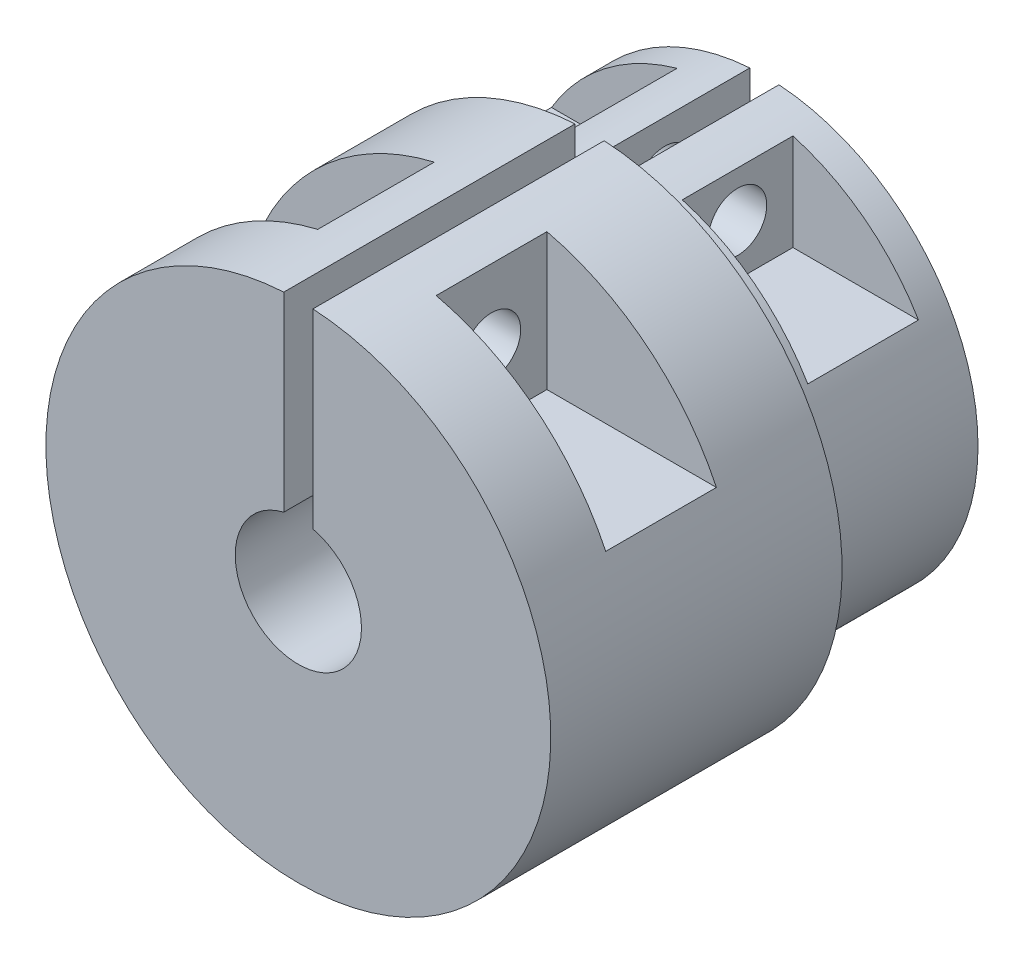
ISO-10303-21;
HEADER;
FILE_DESCRIPTION(('STEP AP214'),'2;1');
FILE_NAME('part.step','',(''),(''),'','','');
FILE_SCHEMA(('AUTOMOTIVE_DESIGN { 1 0 10303 214 1 1 1 1 }'));
ENDSEC;
DATA;
#1=APPLICATION_CONTEXT('core data for automotive mechanical design processes');
#2=APPLICATION_PROTOCOL_DEFINITION('international standard','automotive_design',2000,#1);
#3=PRODUCT_CONTEXT('',#1,'mechanical');
#4=PRODUCT('Part','Part','',(#3));
#5=PRODUCT_RELATED_PRODUCT_CATEGORY('part','',(#4));
#6=PRODUCT_DEFINITION_FORMATION('','',#4);
#7=PRODUCT_DEFINITION_CONTEXT('part definition',#1,'design');
#8=PRODUCT_DEFINITION('design','',#6,#7);
#9=PRODUCT_DEFINITION_SHAPE('','',#8);
#10=(LENGTH_UNIT() NAMED_UNIT(*) SI_UNIT(.MILLI.,.METRE.));
#11=(NAMED_UNIT(*) PLANE_ANGLE_UNIT() SI_UNIT($,.RADIAN.));
#12=(NAMED_UNIT(*) SI_UNIT($,.STERADIAN.) SOLID_ANGLE_UNIT());
#13=UNCERTAINTY_MEASURE_WITH_UNIT(LENGTH_MEASURE(1.E-05),#10,'distance_accuracy_value','');
#14=(GEOMETRIC_REPRESENTATION_CONTEXT(3) GLOBAL_UNCERTAINTY_ASSIGNED_CONTEXT((#13)) GLOBAL_UNIT_ASSIGNED_CONTEXT((#10,
#11,#12)) REPRESENTATION_CONTEXT('',''));
#15=CARTESIAN_POINT('',(0.,0.,0.));
#16=DIRECTION('',(0.,0.,1.));
#17=DIRECTION('',(1.,0.,0.));
#18=AXIS2_PLACEMENT_3D('',#15,#16,#17);
#19=CARTESIAN_POINT('',(0.,0.,9.));
#20=DIRECTION('',(0.,0.,-1.));
#21=DIRECTION('',(-1.,0.,0.));
#22=AXIS2_PLACEMENT_3D('',#19,#20,#21);
#23=CYLINDRICAL_SURFACE('',#22,11.);
#24=DIRECTION('',(0.,0.,-1.));
#25=VECTOR('',#24,1.);
#26=CARTESIAN_POINT('',(-0.75,10.974402033824,9.));
#27=LINE('',#26,#25);
#28=CARTESIAN_POINT('',(-0.75,10.974402033824,9.));
#29=VERTEX_POINT('',#28);
#30=CARTESIAN_POINT('',(-0.75,10.974402033824,0.));
#31=VERTEX_POINT('',#30);
#32=EDGE_CURVE('E278',#29,#31,#27,.T.);
#33=ORIENTED_EDGE('',*,*,#32,.T.);
#34=CARTESIAN_POINT('',(0.,0.,0.));
#35=DIRECTION('',(0.,0.,-1.));
#36=DIRECTION('',(-1.,0.,0.));
#37=AXIS2_PLACEMENT_3D('',#34,#35,#36);
#38=CIRCLE('',#37,11.);
#39=CARTESIAN_POINT('',(0.75,10.974402033824,0.));
#40=VERTEX_POINT('',#39);
#41=EDGE_CURVE('E273',#40,#31,#38,.T.);
#42=ORIENTED_EDGE('',*,*,#41,.F.);
#43=DIRECTION('',(0.,0.,-1.));
#44=VECTOR('',#43,1.);
#45=CARTESIAN_POINT('',(0.75,10.974402033824,9.));
#46=LINE('',#45,#44);
#47=CARTESIAN_POINT('',(0.75,10.974402033824,9.));
#48=VERTEX_POINT('',#47);
#49=EDGE_CURVE('E361',#40,#48,#46,.F.);
#50=ORIENTED_EDGE('',*,*,#49,.T.);
#51=CARTESIAN_POINT('',(0.,0.,9.));
#52=DIRECTION('',(0.,0.,-1.));
#53=DIRECTION('',(-1.,0.,0.));
#54=AXIS2_PLACEMENT_3D('',#51,#52,#53);
#55=CIRCLE('',#54,11.);
#56=EDGE_CURVE('E275',#48,#29,#55,.T.);
#57=ORIENTED_EDGE('',*,*,#56,.T.);
#58=EDGE_LOOP('',(#33,#42,#50,#57));
#59=FACE_BOUND('',#58,.T.);
#60=CARTESIAN_POINT('',(0.,0.,1.5));
#61=DIRECTION('',(0.,0.,-1.));
#62=DIRECTION('',(0.,1.,0.));
#63=AXIS2_PLACEMENT_3D('',#60,#61,#62);
#64=CIRCLE('',#63,11.);
#65=CARTESIAN_POINT('',(-3.,10.5830052442584,1.5));
#66=VERTEX_POINT('',#65);
#67=CARTESIAN_POINT('',(-9.46448963687413,5.60566105945607,1.5));
#68=VERTEX_POINT('',#67);
#69=EDGE_CURVE('E373',#66,#68,#64,.F.);
#70=ORIENTED_EDGE('',*,*,#69,.F.);
#71=DIRECTION('',(0.,0.,-1.));
#72=VECTOR('',#71,1.);
#73=CARTESIAN_POINT('',(-3.,10.5830052442584,9.));
#74=LINE('',#73,#72);
#75=CARTESIAN_POINT('',(-3.,10.5830052442584,7.5));
#76=VERTEX_POINT('',#75);
#77=EDGE_CURVE('E365',#66,#76,#74,.F.);
#78=ORIENTED_EDGE('',*,*,#77,.T.);
#79=CARTESIAN_POINT('',(0.,0.,7.5));
#80=DIRECTION('',(0.,0.,1.));
#81=DIRECTION('',(0.,-1.,0.));
#82=AXIS2_PLACEMENT_3D('',#79,#80,#81);
#83=CIRCLE('',#82,11.);
#84=CARTESIAN_POINT('',(-9.46448963687413,5.60566105945607,7.5));
#85=VERTEX_POINT('',#84);
#86=EDGE_CURVE('E368',#85,#76,#83,.F.);
#87=ORIENTED_EDGE('',*,*,#86,.F.);
#88=DIRECTION('',(0.,0.,-1.));
#89=VECTOR('',#88,1.);
#90=CARTESIAN_POINT('',(-9.46448963687413,5.60566105945607,9.));
#91=LINE('',#90,#89);
#92=EDGE_CURVE('E371',#68,#85,#91,.F.);
#93=ORIENTED_EDGE('',*,*,#92,.F.);
#94=EDGE_LOOP('',(#70,#78,#87,#93));
#95=FACE_BOUND('',#94,.T.);
#96=DIRECTION('',(0.,0.,-1.));
#97=VECTOR('',#96,1.);
#98=CARTESIAN_POINT('',(9.46448963687413,5.60566105945607,9.));
#99=LINE('',#98,#97);
#100=CARTESIAN_POINT('',(9.46448963687413,5.60566105945607,1.53073417001327));
#101=VERTEX_POINT('',#100);
#102=CARTESIAN_POINT('',(9.46448963687413,5.60566105945607,7.23073417001327));
#103=VERTEX_POINT('',#102);
#104=EDGE_CURVE('E39',#101,#103,#99,.F.);
#105=ORIENTED_EDGE('',*,*,#104,.T.);
#106=CARTESIAN_POINT('',(0.,0.,7.23073417001327));
#107=DIRECTION('',(0.,0.,-1.));
#108=DIRECTION('',(0.,1.,0.));
#109=AXIS2_PLACEMENT_3D('',#106,#107,#108);
#110=CIRCLE('',#109,11.);
#111=CARTESIAN_POINT('',(3.,10.5830052442584,7.23073417001327));
#112=VERTEX_POINT('',#111);
#113=EDGE_CURVE('E11',#103,#112,#110,.F.);
#114=ORIENTED_EDGE('',*,*,#113,.T.);
#115=DIRECTION('',(0.,0.,-1.));
#116=VECTOR('',#115,1.);
#117=CARTESIAN_POINT('',(3.,10.5830052442584,9.));
#118=LINE('',#117,#116);
#119=CARTESIAN_POINT('',(3.,10.5830052442584,1.53073417001327));
#120=VERTEX_POINT('',#119);
#121=EDGE_CURVE('E208',#112,#120,#118,.T.);
#122=ORIENTED_EDGE('',*,*,#121,.T.);
#123=CARTESIAN_POINT('',(0.,0.,1.53073417001327));
#124=DIRECTION('',(0.,0.,1.));
#125=DIRECTION('',(0.,-1.,0.));
#126=AXIS2_PLACEMENT_3D('',#123,#124,#125);
#127=CIRCLE('',#126,11.);
#128=EDGE_CURVE('E394',#120,#101,#127,.F.);
#129=ORIENTED_EDGE('',*,*,#128,.T.);
#130=EDGE_LOOP('',(#105,#114,#122,#129));
#131=FACE_BOUND('',#130,.T.);
#132=ADVANCED_FACE('F31',(#59,#95,#131),#23,.T.);
#133=CARTESIAN_POINT('',(13.,8.17444211070876,4.38073417001327));
#134=DIRECTION('',(-1.,0.,0.));
#135=DIRECTION('',(0.,0.,1.));
#136=AXIS2_PLACEMENT_3D('',#133,#134,#135);
#137=CYLINDRICAL_SURFACE('',#136,1.5);
#138=CARTESIAN_POINT('',(0.750000000000001,8.17444211070876,4.38073417001327));
#139=DIRECTION('',(1.,0.,0.));
#140=DIRECTION('',(0.,1.,0.));
#141=AXIS2_PLACEMENT_3D('',#138,#139,#140);
#142=CIRCLE('',#141,1.5);
#143=CARTESIAN_POINT('',(0.750000000000001,9.67444211070876,4.38073417001327));
#144=VERTEX_POINT('',#143);
#145=EDGE_CURVE('E242',#144,#144,#142,.T.);
#146=ORIENTED_EDGE('',*,*,#145,.F.);
#147=EDGE_LOOP('',(#146));
#148=FACE_BOUND('',#147,.T.);
#149=CARTESIAN_POINT('',(3.,8.17444211070876,4.38073417001327));
#150=DIRECTION('',(1.,0.,0.));
#151=DIRECTION('',(0.,0.,-1.));
#152=AXIS2_PLACEMENT_3D('',#149,#150,#151);
#153=CIRCLE('',#152,1.5);
#154=CARTESIAN_POINT('',(3.,8.17444211070876,2.88073417001327));
#155=VERTEX_POINT('',#154);
#156=EDGE_CURVE('E201',#155,#155,#153,.F.);
#157=ORIENTED_EDGE('',*,*,#156,.F.);
#158=EDGE_LOOP('',(#157));
#159=FACE_BOUND('',#158,.T.);
#160=ADVANCED_FACE('F409',(#148,#159),#137,.F.);
#161=CARTESIAN_POINT('',(0.,0.,9.));
#162=DIRECTION('',(0.,0.,-1.));
#163=DIRECTION('',(-1.,0.,0.));
#164=AXIS2_PLACEMENT_3D('',#161,#162,#163);
#165=CYLINDRICAL_SURFACE('',#164,13.);
#166=CARTESIAN_POINT('',(0.,0.,9.));
#167=DIRECTION('',(0.,0.,-1.));
#168=DIRECTION('',(-1.,0.,0.));
#169=AXIS2_PLACEMENT_3D('',#166,#167,#168);
#170=CIRCLE('',#169,13.);
#171=CARTESIAN_POINT('',(0.75,12.9783473524174,9.));
#172=VERTEX_POINT('',#171);
#173=CARTESIAN_POINT('',(-0.75,12.9783473524174,9.));
#174=VERTEX_POINT('',#173);
#175=EDGE_CURVE('E282',#172,#174,#170,.T.);
#176=ORIENTED_EDGE('',*,*,#175,.F.);
#177=DIRECTION('',(0.,0.,-1.));
#178=VECTOR('',#177,1.);
#179=CARTESIAN_POINT('',(0.75,12.9783473524174,9.));
#180=LINE('',#179,#178);
#181=CARTESIAN_POINT('',(0.75,12.9783473524174,24.));
#182=VERTEX_POINT('',#181);
#183=EDGE_CURVE('E310',#172,#182,#180,.F.);
#184=ORIENTED_EDGE('',*,*,#183,.T.);
#185=CARTESIAN_POINT('',(0.,0.,24.));
#186=DIRECTION('',(0.,0.,1.));
#187=DIRECTION('',(1.,0.,0.));
#188=AXIS2_PLACEMENT_3D('',#185,#186,#187);
#189=CIRCLE('',#188,13.);
#190=CARTESIAN_POINT('',(-0.75,12.9783473524174,24.));
#191=VERTEX_POINT('',#190);
#192=EDGE_CURVE('E316',#191,#182,#189,.T.);
#193=ORIENTED_EDGE('',*,*,#192,.F.);
#194=DIRECTION('',(0.,0.,-1.));
#195=VECTOR('',#194,1.);
#196=CARTESIAN_POINT('',(-0.75,12.9783473524174,9.));
#197=LINE('',#196,#195);
#198=EDGE_CURVE('E302',#191,#174,#197,.T.);
#199=ORIENTED_EDGE('',*,*,#198,.T.);
#200=EDGE_LOOP('',(#176,#184,#193,#199));
#201=FACE_BOUND('',#200,.T.);
#202=DIRECTION('',(0.,0.,-1.));
#203=VECTOR('',#202,1.);
#204=CARTESIAN_POINT('',(-11.7293036488318,5.60566105945607,9.));
#205=LINE('',#204,#203);
#206=CARTESIAN_POINT('',(-11.7293036488318,5.60566105945607,20.));
#207=VERTEX_POINT('',#206);
#208=CARTESIAN_POINT('',(-11.7293036488318,5.60566105945607,14.));
#209=VERTEX_POINT('',#208);
#210=EDGE_CURVE('E380',#207,#209,#205,.T.);
#211=ORIENTED_EDGE('',*,*,#210,.T.);
#212=CARTESIAN_POINT('',(0.,0.,14.));
#213=DIRECTION('',(0.,0.,-1.));
#214=DIRECTION('',(0.,1.,0.));
#215=AXIS2_PLACEMENT_3D('',#212,#213,#214);
#216=CIRCLE('',#215,13.);
#217=CARTESIAN_POINT('',(-3.,12.6491106406735,14.));
#218=VERTEX_POINT('',#217);
#219=EDGE_CURVE('E383',#209,#218,#216,.T.);
#220=ORIENTED_EDGE('',*,*,#219,.T.);
#221=DIRECTION('',(0.,0.,-1.));
#222=VECTOR('',#221,1.);
#223=CARTESIAN_POINT('',(-3.,12.6491106406735,9.));
#224=LINE('',#223,#222);
#225=CARTESIAN_POINT('',(-3.,12.6491106406735,20.));
#226=VERTEX_POINT('',#225);
#227=EDGE_CURVE('E375',#226,#218,#224,.T.);
#228=ORIENTED_EDGE('',*,*,#227,.F.);
#229=CARTESIAN_POINT('',(0.,0.,20.));
#230=DIRECTION('',(0.,0.,1.));
#231=DIRECTION('',(1.,0.,0.));
#232=AXIS2_PLACEMENT_3D('',#229,#230,#231);
#233=CIRCLE('',#232,13.);
#234=EDGE_CURVE('E377',#226,#207,#233,.T.);
#235=ORIENTED_EDGE('',*,*,#234,.T.);
#236=EDGE_LOOP('',(#211,#220,#228,#235));
#237=FACE_BOUND('',#236,.T.);
#238=CARTESIAN_POINT('',(0.,0.,19.9004847787341));
#239=DIRECTION('',(0.,0.,-1.));
#240=DIRECTION('',(-1.,0.,0.));
#241=AXIS2_PLACEMENT_3D('',#238,#239,#240);
#242=CIRCLE('',#241,13.);
#243=CARTESIAN_POINT('',(3.,12.6491106406735,19.9004847787341));
#244=VERTEX_POINT('',#243);
#245=CARTESIAN_POINT('',(11.7293036488318,5.60566105945607,19.9004847787341));
#246=VERTEX_POINT('',#245);
#247=EDGE_CURVE('E392',#244,#246,#242,.T.);
#248=ORIENTED_EDGE('',*,*,#247,.F.);
#249=DIRECTION('',(0.,0.,-1.));
#250=VECTOR('',#249,1.);
#251=CARTESIAN_POINT('',(3.,12.6491106406735,9.));
#252=LINE('',#251,#250);
#253=CARTESIAN_POINT('',(3.,12.6491106406735,14.2004847787341));
#254=VERTEX_POINT('',#253);
#255=EDGE_CURVE('E228',#254,#244,#252,.F.);
#256=ORIENTED_EDGE('',*,*,#255,.F.);
#257=CARTESIAN_POINT('',(0.,0.,14.2004847787341));
#258=DIRECTION('',(0.,0.,1.));
#259=DIRECTION('',(1.,0.,0.));
#260=AXIS2_PLACEMENT_3D('',#257,#258,#259);
#261=CIRCLE('',#260,13.);
#262=CARTESIAN_POINT('',(11.7293036488318,5.60566105945607,14.2004847787341));
#263=VERTEX_POINT('',#262);
#264=EDGE_CURVE('E386',#263,#254,#261,.T.);
#265=ORIENTED_EDGE('',*,*,#264,.F.);
#266=DIRECTION('',(0.,0.,-1.));
#267=VECTOR('',#266,1.);
#268=CARTESIAN_POINT('',(11.7293036488318,5.60566105945607,9.));
#269=LINE('',#268,#267);
#270=EDGE_CURVE('E390',#246,#263,#269,.T.);
#271=ORIENTED_EDGE('',*,*,#270,.F.);
#272=EDGE_LOOP('',(#248,#256,#265,#271));
#273=FACE_BOUND('',#272,.T.);
#274=ADVANCED_FACE('F33',(#201,#237,#273),#165,.T.);
#275=CARTESIAN_POINT('',(13.,8.95813802465025,17.0504847787341));
#276=DIRECTION('',(-1.,0.,0.));
#277=DIRECTION('',(0.,0.,1.));
#278=AXIS2_PLACEMENT_3D('',#275,#276,#277);
#279=CYLINDRICAL_SURFACE('',#278,1.5);
#280=CARTESIAN_POINT('',(0.750000000000001,8.95813802465025,17.0504847787341));
#281=DIRECTION('',(1.,0.,0.));
#282=DIRECTION('',(0.,1.,0.));
#283=AXIS2_PLACEMENT_3D('',#280,#281,#282);
#284=CIRCLE('',#283,1.5);
#285=CARTESIAN_POINT('',(0.750000000000001,10.4581380246502,17.0504847787341));
#286=VERTEX_POINT('',#285);
#287=EDGE_CURVE('E233',#286,#286,#284,.T.);
#288=ORIENTED_EDGE('',*,*,#287,.F.);
#289=EDGE_LOOP('',(#288));
#290=FACE_BOUND('',#289,.T.);
#291=CARTESIAN_POINT('',(3.,8.95813802465025,17.0504847787341));
#292=DIRECTION('',(1.,0.,0.));
#293=DIRECTION('',(0.,0.,-1.));
#294=AXIS2_PLACEMENT_3D('',#291,#292,#293);
#295=CIRCLE('',#294,1.5);
#296=CARTESIAN_POINT('',(3.,8.95813802465025,15.5504847787341));
#297=VERTEX_POINT('',#296);
#298=EDGE_CURVE('E227',#297,#297,#295,.F.);
#299=ORIENTED_EDGE('',*,*,#298,.F.);
#300=EDGE_LOOP('',(#299));
#301=FACE_BOUND('',#300,.T.);
#302=ADVANCED_FACE('F465',(#290,#301),#279,.F.);
#303=CARTESIAN_POINT('',(0.,0.,0.));
#304=DIRECTION('',(0.,0.,1.));
#305=DIRECTION('',(1.,0.,0.));
#306=AXIS2_PLACEMENT_3D('',#303,#304,#305);
#307=PLANE('',#306);
#308=ORIENTED_EDGE('',*,*,#41,.T.);
#309=DIRECTION('',(0.,1.,0.));
#310=VECTOR('',#309,1.);
#311=CARTESIAN_POINT('',(-0.75,13.1930163844394,0.));
#312=LINE('',#311,#310);
#313=CARTESIAN_POINT('',(-0.749999999999999,5.75130419991848,0.));
#314=VERTEX_POINT('',#313);
#315=EDGE_CURVE('E291',#314,#31,#312,.T.);
#316=ORIENTED_EDGE('',*,*,#315,.F.);
#317=CARTESIAN_POINT('',(0.,0.,0.));
#318=DIRECTION('',(0.,0.,1.));
#319=DIRECTION('',(-1.,0.,0.));
#320=AXIS2_PLACEMENT_3D('',#317,#318,#319);
#321=CIRCLE('',#320,5.8);
#322=CARTESIAN_POINT('',(-4.5,3.6592348927064,0.));
#323=VERTEX_POINT('',#322);
#324=EDGE_CURVE('E321',#314,#323,#321,.T.);
#325=ORIENTED_EDGE('',*,*,#324,.T.);
#326=DIRECTION('',(0.,-1.,0.));
#327=VECTOR('',#326,1.);
#328=CARTESIAN_POINT('',(-4.5,3.6592348927064,0.));
#329=LINE('',#328,#327);
#330=CARTESIAN_POINT('',(-4.5,-3.6592348927064,0.));
#331=VERTEX_POINT('',#330);
#332=EDGE_CURVE('E339',#323,#331,#329,.T.);
#333=ORIENTED_EDGE('',*,*,#332,.T.);
#334=CARTESIAN_POINT('',(0.,0.,0.));
#335=DIRECTION('',(0.,0.,1.));
#336=DIRECTION('',(1.,0.,0.));
#337=AXIS2_PLACEMENT_3D('',#334,#335,#336);
#338=CIRCLE('',#337,5.8);
#339=CARTESIAN_POINT('',(4.5,-3.6592348927064,0.));
#340=VERTEX_POINT('',#339);
#341=EDGE_CURVE('E342',#331,#340,#338,.T.);
#342=ORIENTED_EDGE('',*,*,#341,.T.);
#343=DIRECTION('',(0.,1.,0.));
#344=VECTOR('',#343,1.);
#345=CARTESIAN_POINT('',(4.5,-3.6592348927064,0.));
#346=LINE('',#345,#344);
#347=CARTESIAN_POINT('',(4.5,3.6592348927064,0.));
#348=VERTEX_POINT('',#347);
#349=EDGE_CURVE('E345',#340,#348,#346,.T.);
#350=ORIENTED_EDGE('',*,*,#349,.T.);
#351=CARTESIAN_POINT('',(0.749999999999999,5.75130419991848,0.));
#352=VERTEX_POINT('',#351);
#353=EDGE_CURVE('E336',#348,#352,#321,.T.);
#354=ORIENTED_EDGE('',*,*,#353,.T.);
#355=DIRECTION('',(0.,-1.,0.));
#356=VECTOR('',#355,1.);
#357=CARTESIAN_POINT('',(0.75,13.1930163844394,0.));
#358=LINE('',#357,#356);
#359=EDGE_CURVE('E286',#40,#352,#358,.T.);
#360=ORIENTED_EDGE('',*,*,#359,.F.);
#361=EDGE_LOOP('',(#308,#316,#325,#333,#342,#350,#354,#360));
#362=FACE_BOUND('',#361,.T.);
#363=ADVANCED_FACE('F432',(#362),#307,.F.);
#364=CARTESIAN_POINT('',(-0.75,13.1930163844394,24.));
#365=DIRECTION('',(-1.,0.,0.));
#366=DIRECTION('',(0.,-1.,0.));
#367=AXIS2_PLACEMENT_3D('',#364,#365,#366);
#368=PLANE('',#367);
#369=CARTESIAN_POINT('',(-0.750000000000001,8.95813802465025,17.0504847787341));
#370=DIRECTION('',(-1.,0.,0.));
#371=DIRECTION('',(0.,-1.,0.));
#372=AXIS2_PLACEMENT_3D('',#369,#370,#371);
#373=CIRCLE('',#372,1.5);
#374=CARTESIAN_POINT('',(-0.75,7.45813802465025,17.0504847787341));
#375=VERTEX_POINT('',#374);
#376=EDGE_CURVE('E236',#375,#375,#373,.T.);
#377=ORIENTED_EDGE('',*,*,#376,.T.);
#378=EDGE_LOOP('',(#377));
#379=FACE_BOUND('',#378,.T.);
#380=CARTESIAN_POINT('',(-0.750000000000001,8.17444211070876,4.38073417001327));
#381=DIRECTION('',(-1.,0.,0.));
#382=DIRECTION('',(0.,-1.,0.));
#383=AXIS2_PLACEMENT_3D('',#380,#381,#382);
#384=CIRCLE('',#383,1.5);
#385=CARTESIAN_POINT('',(-0.75,6.67444211070876,4.38073417001327));
#386=VERTEX_POINT('',#385);
#387=EDGE_CURVE('E245',#386,#386,#384,.T.);
#388=ORIENTED_EDGE('',*,*,#387,.T.);
#389=EDGE_LOOP('',(#388));
#390=FACE_BOUND('',#389,.T.);
#391=DIRECTION('',(0.,-1.,0.));
#392=VECTOR('',#391,1.);
#393=CARTESIAN_POINT('',(-0.75,13.1930163844394,9.));
#394=LINE('',#393,#392);
#395=EDGE_CURVE('E284',#174,#29,#394,.T.);
#396=ORIENTED_EDGE('',*,*,#395,.F.);
#397=ORIENTED_EDGE('',*,*,#198,.F.);
#398=DIRECTION('',(0.,1.,0.));
#399=VECTOR('',#398,1.);
#400=CARTESIAN_POINT('',(-0.75,13.1930163844394,24.));
#401=LINE('',#400,#399);
#402=CARTESIAN_POINT('',(-0.749999999999999,3.16227766016838,24.));
#403=VERTEX_POINT('',#402);
#404=EDGE_CURVE('E290',#403,#191,#401,.T.);
#405=ORIENTED_EDGE('',*,*,#404,.F.);
#406=DIRECTION('',(0.,0.,-1.));
#407=VECTOR('',#406,1.);
#408=CARTESIAN_POINT('',(-0.749999999999999,3.16227766016838,24.));
#409=LINE('',#408,#407);
#410=CARTESIAN_POINT('',(-0.749999999999999,3.16227766016838,9.));
#411=VERTEX_POINT('',#410);
#412=EDGE_CURVE('E357',#403,#411,#409,.T.);
#413=ORIENTED_EDGE('',*,*,#412,.T.);
#414=DIRECTION('',(0.,-1.,0.));
#415=VECTOR('',#414,1.);
#416=CARTESIAN_POINT('',(-0.749999999999998,0.,9.));
#417=LINE('',#416,#415);
#418=CARTESIAN_POINT('',(-0.749999999999999,5.75130419991848,9.));
#419=VERTEX_POINT('',#418);
#420=EDGE_CURVE('E294',#419,#411,#417,.T.);
#421=ORIENTED_EDGE('',*,*,#420,.F.);
#422=DIRECTION('',(0.,0.,-1.));
#423=VECTOR('',#422,1.);
#424=CARTESIAN_POINT('',(-0.749999999999999,5.75130419991848,9.));
#425=LINE('',#424,#423);
#426=EDGE_CURVE('E300',#419,#314,#425,.T.);
#427=ORIENTED_EDGE('',*,*,#426,.T.);
#428=ORIENTED_EDGE('',*,*,#315,.T.);
#429=ORIENTED_EDGE('',*,*,#32,.F.);
#430=EDGE_LOOP('',(#396,#397,#405,#413,#421,#427,#428,#429));
#431=FACE_BOUND('',#430,.T.);
#432=ADVANCED_FACE('F428',(#379,#390,#431),#368,.F.);
#433=CARTESIAN_POINT('',(0.75,13.1930163844394,24.));
#434=DIRECTION('',(1.,0.,0.));
#435=DIRECTION('',(0.,1.,0.));
#436=AXIS2_PLACEMENT_3D('',#433,#434,#435);
#437=PLANE('',#436);
#438=ORIENTED_EDGE('',*,*,#287,.T.);
#439=EDGE_LOOP('',(#438));
#440=FACE_BOUND('',#439,.T.);
#441=ORIENTED_EDGE('',*,*,#145,.T.);
#442=EDGE_LOOP('',(#441));
#443=FACE_BOUND('',#442,.T.);
#444=DIRECTION('',(0.,1.,0.));
#445=VECTOR('',#444,1.);
#446=CARTESIAN_POINT('',(0.75,13.1930163844394,9.));
#447=LINE('',#446,#445);
#448=EDGE_CURVE('E363',#48,#172,#447,.T.);
#449=ORIENTED_EDGE('',*,*,#448,.F.);
#450=ORIENTED_EDGE('',*,*,#49,.F.);
#451=ORIENTED_EDGE('',*,*,#359,.T.);
#452=DIRECTION('',(0.,0.,-1.));
#453=VECTOR('',#452,1.);
#454=CARTESIAN_POINT('',(0.749999999999999,5.75130419991848,9.));
#455=LINE('',#454,#453);
#456=CARTESIAN_POINT('',(0.749999999999999,5.75130419991848,9.));
#457=VERTEX_POINT('',#456);
#458=EDGE_CURVE('E308',#352,#457,#455,.F.);
#459=ORIENTED_EDGE('',*,*,#458,.T.);
#460=DIRECTION('',(0.,1.,0.));
#461=VECTOR('',#460,1.);
#462=CARTESIAN_POINT('',(0.749999999999998,0.,9.));
#463=LINE('',#462,#461);
#464=CARTESIAN_POINT('',(0.749999999999999,3.16227766016838,9.));
#465=VERTEX_POINT('',#464);
#466=EDGE_CURVE('E305',#465,#457,#463,.T.);
#467=ORIENTED_EDGE('',*,*,#466,.F.);
#468=DIRECTION('',(0.,0.,-1.));
#469=VECTOR('',#468,1.);
#470=CARTESIAN_POINT('',(0.749999999999999,3.16227766016838,24.));
#471=LINE('',#470,#469);
#472=CARTESIAN_POINT('',(0.749999999999999,3.16227766016838,24.));
#473=VERTEX_POINT('',#472);
#474=EDGE_CURVE('E359',#465,#473,#471,.F.);
#475=ORIENTED_EDGE('',*,*,#474,.T.);
#476=DIRECTION('',(0.,-1.,0.));
#477=VECTOR('',#476,1.);
#478=CARTESIAN_POINT('',(0.75,13.1930163844394,24.));
#479=LINE('',#478,#477);
#480=EDGE_CURVE('E287',#182,#473,#479,.T.);
#481=ORIENTED_EDGE('',*,*,#480,.F.);
#482=ORIENTED_EDGE('',*,*,#183,.F.);
#483=EDGE_LOOP('',(#449,#450,#451,#459,#467,#475,#481,#482));
#484=FACE_BOUND('',#483,.T.);
#485=ADVANCED_FACE('F431',(#440,#443,#484),#437,.F.);
#486=CARTESIAN_POINT('',(0.,0.,9.));
#487=DIRECTION('',(0.,0.,-1.));
#488=DIRECTION('',(-1.,0.,0.));
#489=AXIS2_PLACEMENT_3D('',#486,#487,#488);
#490=CYLINDRICAL_SURFACE('',#489,5.8);
#491=ORIENTED_EDGE('',*,*,#458,.F.);
#492=ORIENTED_EDGE('',*,*,#353,.F.);
#493=DIRECTION('',(0.,0.,-1.));
#494=VECTOR('',#493,1.);
#495=CARTESIAN_POINT('',(4.5,3.6592348927064,9.));
#496=LINE('',#495,#494);
#497=CARTESIAN_POINT('',(4.5,3.6592348927064,9.));
#498=VERTEX_POINT('',#497);
#499=EDGE_CURVE('E335',#498,#348,#496,.T.);
#500=ORIENTED_EDGE('',*,*,#499,.F.);
#501=CARTESIAN_POINT('',(0.,0.,9.));
#502=DIRECTION('',(0.,0.,1.));
#503=DIRECTION('',(-1.,0.,0.));
#504=AXIS2_PLACEMENT_3D('',#501,#502,#503);
#505=CIRCLE('',#504,5.8);
#506=EDGE_CURVE('E322',#498,#457,#505,.T.);
#507=ORIENTED_EDGE('',*,*,#506,.T.);
#508=EDGE_LOOP('',(#491,#492,#500,#507));
#509=FACE_BOUND('',#508,.T.);
#510=ADVANCED_FACE('F436',(#509),#490,.F.);
#511=ORIENTED_EDGE('',*,*,#426,.F.);
#512=CARTESIAN_POINT('',(-4.5,3.6592348927064,9.));
#513=VERTEX_POINT('',#512);
#514=EDGE_CURVE('E326',#419,#513,#505,.T.);
#515=ORIENTED_EDGE('',*,*,#514,.T.);
#516=DIRECTION('',(0.,0.,-1.));
#517=VECTOR('',#516,1.);
#518=CARTESIAN_POINT('',(-4.5,3.6592348927064,9.));
#519=LINE('',#518,#517);
#520=EDGE_CURVE('E354',#513,#323,#519,.T.);
#521=ORIENTED_EDGE('',*,*,#520,.T.);
#522=ORIENTED_EDGE('',*,*,#324,.F.);
#523=EDGE_LOOP('',(#511,#515,#521,#522));
#524=FACE_BOUND('',#523,.T.);
#525=ADVANCED_FACE('F460',(#524),#490,.F.);
#526=CARTESIAN_POINT('',(-4.5,3.6592348927064,9.));
#527=DIRECTION('',(1.,0.,0.));
#528=DIRECTION('',(0.,0.,-1.));
#529=AXIS2_PLACEMENT_3D('',#526,#527,#528);
#530=PLANE('',#529);
#531=ORIENTED_EDGE('',*,*,#332,.F.);
#532=ORIENTED_EDGE('',*,*,#520,.F.);
#533=DIRECTION('',(0.,-1.,0.));
#534=VECTOR('',#533,1.);
#535=CARTESIAN_POINT('',(-4.5,3.6592348927064,9.));
#536=LINE('',#535,#534);
#537=CARTESIAN_POINT('',(-4.5,-3.6592348927064,9.));
#538=VERTEX_POINT('',#537);
#539=EDGE_CURVE('E325',#513,#538,#536,.T.);
#540=ORIENTED_EDGE('',*,*,#539,.T.);
#541=DIRECTION('',(0.,0.,-1.));
#542=VECTOR('',#541,1.);
#543=CARTESIAN_POINT('',(-4.5,-3.6592348927064,9.));
#544=LINE('',#543,#542);
#545=EDGE_CURVE('E352',#538,#331,#544,.T.);
#546=ORIENTED_EDGE('',*,*,#545,.T.);
#547=EDGE_LOOP('',(#531,#532,#540,#546));
#548=FACE_BOUND('',#547,.T.);
#549=ADVANCED_FACE('F456',(#548),#530,.T.);
#550=CARTESIAN_POINT('',(0.,0.,9.));
#551=DIRECTION('',(0.,0.,-1.));
#552=DIRECTION('',(-1.,0.,0.));
#553=AXIS2_PLACEMENT_3D('',#550,#551,#552);
#554=CYLINDRICAL_SURFACE('',#553,5.8);
#555=ORIENTED_EDGE('',*,*,#341,.F.);
#556=ORIENTED_EDGE('',*,*,#545,.F.);
#557=CARTESIAN_POINT('',(0.,0.,9.));
#558=DIRECTION('',(0.,0.,1.));
#559=DIRECTION('',(1.,0.,0.));
#560=AXIS2_PLACEMENT_3D('',#557,#558,#559);
#561=CIRCLE('',#560,5.8);
#562=CARTESIAN_POINT('',(4.5,-3.6592348927064,9.));
#563=VERTEX_POINT('',#562);
#564=EDGE_CURVE('E329',#538,#563,#561,.T.);
#565=ORIENTED_EDGE('',*,*,#564,.T.);
#566=DIRECTION('',(0.,0.,-1.));
#567=VECTOR('',#566,1.);
#568=CARTESIAN_POINT('',(4.5,-3.6592348927064,9.));
#569=LINE('',#568,#567);
#570=EDGE_CURVE('E350',#563,#340,#569,.T.);
#571=ORIENTED_EDGE('',*,*,#570,.T.);
#572=EDGE_LOOP('',(#555,#556,#565,#571));
#573=FACE_BOUND('',#572,.T.);
#574=ADVANCED_FACE('F452',(#573),#554,.F.);
#575=CARTESIAN_POINT('',(4.5,-3.6592348927064,9.));
#576=DIRECTION('',(-1.,0.,0.));
#577=DIRECTION('',(0.,0.,1.));
#578=AXIS2_PLACEMENT_3D('',#575,#576,#577);
#579=PLANE('',#578);
#580=ORIENTED_EDGE('',*,*,#349,.F.);
#581=ORIENTED_EDGE('',*,*,#570,.F.);
#582=DIRECTION('',(0.,1.,0.));
#583=VECTOR('',#582,1.);
#584=CARTESIAN_POINT('',(4.5,-3.6592348927064,9.));
#585=LINE('',#584,#583);
#586=EDGE_CURVE('E332',#563,#498,#585,.T.);
#587=ORIENTED_EDGE('',*,*,#586,.T.);
#588=ORIENTED_EDGE('',*,*,#499,.T.);
#589=EDGE_LOOP('',(#580,#581,#587,#588));
#590=FACE_BOUND('',#589,.T.);
#591=ADVANCED_FACE('F445',(#590),#579,.T.);
#592=CARTESIAN_POINT('',(0.,0.,24.));
#593=DIRECTION('',(0.,0.,1.));
#594=DIRECTION('',(1.,0.,0.));
#595=AXIS2_PLACEMENT_3D('',#592,#593,#594);
#596=PLANE('',#595);
#597=ORIENTED_EDGE('',*,*,#480,.T.);
#598=CARTESIAN_POINT('',(0.,0.,24.));
#599=DIRECTION('',(0.,0.,1.));
#600=DIRECTION('',(1.,0.,0.));
#601=AXIS2_PLACEMENT_3D('',#598,#599,#600);
#602=CIRCLE('',#601,3.25);
#603=EDGE_CURVE('E313',#403,#473,#602,.T.);
#604=ORIENTED_EDGE('',*,*,#603,.F.);
#605=ORIENTED_EDGE('',*,*,#404,.T.);
#606=ORIENTED_EDGE('',*,*,#192,.T.);
#607=EDGE_LOOP('',(#597,#604,#605,#606));
#608=FACE_BOUND('',#607,.T.);
#609=ADVANCED_FACE('F442',(#608),#596,.T.);
#610=CARTESIAN_POINT('',(0.,0.,9.));
#611=DIRECTION('',(0.,0.,1.));
#612=DIRECTION('',(1.,0.,0.));
#613=AXIS2_PLACEMENT_3D('',#610,#611,#612);
#614=PLANE('',#613);
#615=CARTESIAN_POINT('',(0.,0.,9.));
#616=DIRECTION('',(0.,0.,1.));
#617=DIRECTION('',(1.,0.,0.));
#618=AXIS2_PLACEMENT_3D('',#615,#616,#617);
#619=CIRCLE('',#618,3.25);
#620=EDGE_CURVE('E312',#411,#465,#619,.T.);
#621=ORIENTED_EDGE('',*,*,#620,.T.);
#622=ORIENTED_EDGE('',*,*,#466,.T.);
#623=ORIENTED_EDGE('',*,*,#506,.F.);
#624=ORIENTED_EDGE('',*,*,#586,.F.);
#625=ORIENTED_EDGE('',*,*,#564,.F.);
#626=ORIENTED_EDGE('',*,*,#539,.F.);
#627=ORIENTED_EDGE('',*,*,#514,.F.);
#628=ORIENTED_EDGE('',*,*,#420,.T.);
#629=EDGE_LOOP('',(#621,#622,#623,#624,#625,#626,#627,#628));
#630=FACE_BOUND('',#629,.T.);
#631=ADVANCED_FACE('F440',(#630),#614,.F.);
#632=CARTESIAN_POINT('',(0.,0.,24.));
#633=DIRECTION('',(0.,0.,-1.));
#634=DIRECTION('',(-1.,0.,0.));
#635=AXIS2_PLACEMENT_3D('',#632,#633,#634);
#636=CYLINDRICAL_SURFACE('',#635,3.25);
#637=ORIENTED_EDGE('',*,*,#474,.F.);
#638=ORIENTED_EDGE('',*,*,#620,.F.);
#639=ORIENTED_EDGE('',*,*,#412,.F.);
#640=ORIENTED_EDGE('',*,*,#603,.T.);
#641=EDGE_LOOP('',(#637,#638,#639,#640));
#642=FACE_BOUND('',#641,.T.);
#643=ADVANCED_FACE('F426',(#642),#636,.F.);
#644=CARTESIAN_POINT('',(0.,0.,9.));
#645=DIRECTION('',(0.,0.,-1.));
#646=DIRECTION('',(-1.,0.,0.));
#647=AXIS2_PLACEMENT_3D('',#644,#645,#646);
#648=PLANE('',#647);
#649=ORIENTED_EDGE('',*,*,#395,.T.);
#650=ORIENTED_EDGE('',*,*,#56,.F.);
#651=ORIENTED_EDGE('',*,*,#448,.T.);
#652=ORIENTED_EDGE('',*,*,#175,.T.);
#653=EDGE_LOOP('',(#649,#650,#651,#652));
#654=FACE_BOUND('',#653,.T.);
#655=ADVANCED_FACE('F423',(#654),#648,.T.);
#656=CARTESIAN_POINT('',(-23.,10.974402033824,1.5));
#657=DIRECTION('',(0.,0.,-1.));
#658=DIRECTION('',(0.,1.,0.));
#659=AXIS2_PLACEMENT_3D('',#656,#657,#658);
#660=PLANE('',#659);
#661=ORIENTED_EDGE('',*,*,#69,.T.);
#662=DIRECTION('',(1.,0.,0.));
#663=VECTOR('',#662,1.);
#664=CARTESIAN_POINT('',(-23.,5.60566105945607,1.5));
#665=LINE('',#664,#663);
#666=CARTESIAN_POINT('',(-3.,5.60566105945607,1.5));
#667=VERTEX_POINT('',#666);
#668=EDGE_CURVE('E271',#68,#667,#665,.T.);
#669=ORIENTED_EDGE('',*,*,#668,.T.);
#670=DIRECTION('',(0.,1.,0.));
#671=VECTOR('',#670,1.);
#672=CARTESIAN_POINT('',(-3.,10.974402033824,1.5));
#673=LINE('',#672,#671);
#674=EDGE_CURVE('E260',#667,#66,#673,.T.);
#675=ORIENTED_EDGE('',*,*,#674,.T.);
#676=EDGE_LOOP('',(#661,#669,#675));
#677=FACE_BOUND('',#676,.T.);
#678=ADVANCED_FACE('F421',(#677),#660,.F.);
#679=CARTESIAN_POINT('',(-23.,5.60566105945607,1.5));
#680=DIRECTION('',(0.,-1.,0.));
#681=DIRECTION('',(0.,0.,-1.));
#682=AXIS2_PLACEMENT_3D('',#679,#680,#681);
#683=PLANE('',#682);
#684=ORIENTED_EDGE('',*,*,#92,.T.);
#685=DIRECTION('',(1.,0.,0.));
#686=VECTOR('',#685,1.);
#687=CARTESIAN_POINT('',(-23.,5.60566105945607,7.5));
#688=LINE('',#687,#686);
#689=CARTESIAN_POINT('',(-3.,5.60566105945607,7.5));
#690=VERTEX_POINT('',#689);
#691=EDGE_CURVE('E270',#85,#690,#688,.T.);
#692=ORIENTED_EDGE('',*,*,#691,.T.);
#693=DIRECTION('',(0.,0.,-1.));
#694=VECTOR('',#693,1.);
#695=CARTESIAN_POINT('',(-3.,5.60566105945607,1.5));
#696=LINE('',#695,#694);
#697=EDGE_CURVE('E267',#690,#667,#696,.T.);
#698=ORIENTED_EDGE('',*,*,#697,.T.);
#699=ORIENTED_EDGE('',*,*,#668,.F.);
#700=EDGE_LOOP('',(#684,#692,#698,#699));
#701=FACE_BOUND('',#700,.T.);
#702=ADVANCED_FACE('F558',(#701),#683,.F.);
#703=CARTESIAN_POINT('',(-23.,10.974402033824,7.5));
#704=DIRECTION('',(0.,0.,1.));
#705=DIRECTION('',(0.,-1.,0.));
#706=AXIS2_PLACEMENT_3D('',#703,#704,#705);
#707=PLANE('',#706);
#708=ORIENTED_EDGE('',*,*,#86,.T.);
#709=DIRECTION('',(0.,-1.,0.));
#710=VECTOR('',#709,1.);
#711=CARTESIAN_POINT('',(-3.,10.974402033824,7.5));
#712=LINE('',#711,#710);
#713=EDGE_CURVE('E264',#76,#690,#712,.T.);
#714=ORIENTED_EDGE('',*,*,#713,.T.);
#715=ORIENTED_EDGE('',*,*,#691,.F.);
#716=EDGE_LOOP('',(#708,#714,#715));
#717=FACE_BOUND('',#716,.T.);
#718=ADVANCED_FACE('F556',(#717),#707,.F.);
#719=CARTESIAN_POINT('',(-3.,5.60566105945607,1.5));
#720=DIRECTION('',(-1.,0.,0.));
#721=DIRECTION('',(0.,0.,1.));
#722=AXIS2_PLACEMENT_3D('',#719,#720,#721);
#723=PLANE('',#722);
#724=CARTESIAN_POINT('',(-3.,8.17444211070876,4.38073417001327));
#725=DIRECTION('',(-1.,0.,0.));
#726=DIRECTION('',(0.,0.,1.));
#727=AXIS2_PLACEMENT_3D('',#724,#725,#726);
#728=CIRCLE('',#727,1.5);
#729=CARTESIAN_POINT('',(-3.,8.17444211070876,5.88073417001327));
#730=VERTEX_POINT('',#729);
#731=EDGE_CURVE('E239',#730,#730,#728,.T.);
#732=ORIENTED_EDGE('',*,*,#731,.F.);
#733=EDGE_LOOP('',(#732));
#734=FACE_BOUND('',#733,.T.);
#735=ORIENTED_EDGE('',*,*,#674,.F.);
#736=ORIENTED_EDGE('',*,*,#697,.F.);
#737=ORIENTED_EDGE('',*,*,#713,.F.);
#738=ORIENTED_EDGE('',*,*,#77,.F.);
#739=EDGE_LOOP('',(#735,#736,#737,#738));
#740=FACE_BOUND('',#739,.T.);
#741=ADVANCED_FACE('F552',(#734,#740),#723,.T.);
#742=CARTESIAN_POINT('',(-23.,12.9783473524174,14.));
#743=DIRECTION('',(0.,0.,-1.));
#744=DIRECTION('',(0.,1.,0.));
#745=AXIS2_PLACEMENT_3D('',#742,#743,#744);
#746=PLANE('',#745);
#747=DIRECTION('',(1.,0.,0.));
#748=VECTOR('',#747,1.);
#749=CARTESIAN_POINT('',(-23.,5.60566105945607,14.));
#750=LINE('',#749,#748);
#751=CARTESIAN_POINT('',(-3.,5.60566105945607,14.));
#752=VERTEX_POINT('',#751);
#753=EDGE_CURVE('E258',#209,#752,#750,.T.);
#754=ORIENTED_EDGE('',*,*,#753,.T.);
#755=DIRECTION('',(0.,1.,0.));
#756=VECTOR('',#755,1.);
#757=CARTESIAN_POINT('',(-3.,12.9783473524174,14.));
#758=LINE('',#757,#756);
#759=EDGE_CURVE('E248',#752,#218,#758,.T.);
#760=ORIENTED_EDGE('',*,*,#759,.T.);
#761=ORIENTED_EDGE('',*,*,#219,.F.);
#762=EDGE_LOOP('',(#754,#760,#761));
#763=FACE_BOUND('',#762,.T.);
#764=ADVANCED_FACE('F545',(#763),#746,.F.);
#765=CARTESIAN_POINT('',(-23.,5.60566105945607,14.));
#766=DIRECTION('',(0.,-1.,0.));
#767=DIRECTION('',(0.,0.,-1.));
#768=AXIS2_PLACEMENT_3D('',#765,#766,#767);
#769=PLANE('',#768);
#770=DIRECTION('',(1.,0.,0.));
#771=VECTOR('',#770,1.);
#772=CARTESIAN_POINT('',(-23.,5.60566105945607,20.));
#773=LINE('',#772,#771);
#774=CARTESIAN_POINT('',(-3.,5.60566105945607,20.));
#775=VERTEX_POINT('',#774);
#776=EDGE_CURVE('E257',#207,#775,#773,.T.);
#777=ORIENTED_EDGE('',*,*,#776,.T.);
#778=DIRECTION('',(0.,0.,-1.));
#779=VECTOR('',#778,1.);
#780=CARTESIAN_POINT('',(-3.,5.60566105945607,14.));
#781=LINE('',#780,#779);
#782=EDGE_CURVE('E254',#775,#752,#781,.T.);
#783=ORIENTED_EDGE('',*,*,#782,.T.);
#784=ORIENTED_EDGE('',*,*,#753,.F.);
#785=ORIENTED_EDGE('',*,*,#210,.F.);
#786=EDGE_LOOP('',(#777,#783,#784,#785));
#787=FACE_BOUND('',#786,.T.);
#788=ADVANCED_FACE('F542',(#787),#769,.F.);
#789=CARTESIAN_POINT('',(-23.,12.9783473524174,20.));
#790=DIRECTION('',(0.,0.,1.));
#791=DIRECTION('',(1.,0.,0.));
#792=AXIS2_PLACEMENT_3D('',#789,#790,#791);
#793=PLANE('',#792);
#794=DIRECTION('',(0.,-1.,0.));
#795=VECTOR('',#794,1.);
#796=CARTESIAN_POINT('',(-3.,12.9783473524174,20.));
#797=LINE('',#796,#795);
#798=EDGE_CURVE('E251',#226,#775,#797,.T.);
#799=ORIENTED_EDGE('',*,*,#798,.T.);
#800=ORIENTED_EDGE('',*,*,#776,.F.);
#801=ORIENTED_EDGE('',*,*,#234,.F.);
#802=EDGE_LOOP('',(#799,#800,#801));
#803=FACE_BOUND('',#802,.T.);
#804=ADVANCED_FACE('F540',(#803),#793,.F.);
#805=CARTESIAN_POINT('',(-3.,5.60566105945607,14.));
#806=DIRECTION('',(-1.,0.,0.));
#807=DIRECTION('',(0.,0.,1.));
#808=AXIS2_PLACEMENT_3D('',#805,#806,#807);
#809=PLANE('',#808);
#810=CARTESIAN_POINT('',(-3.,8.95813802465025,17.0504847787341));
#811=DIRECTION('',(-1.,0.,0.));
#812=DIRECTION('',(0.,0.,1.));
#813=AXIS2_PLACEMENT_3D('',#810,#811,#812);
#814=CIRCLE('',#813,1.5);
#815=CARTESIAN_POINT('',(-3.,8.95813802465025,18.5504847787341));
#816=VERTEX_POINT('',#815);
#817=EDGE_CURVE('E230',#816,#816,#814,.T.);
#818=ORIENTED_EDGE('',*,*,#817,.F.);
#819=EDGE_LOOP('',(#818));
#820=FACE_BOUND('',#819,.T.);
#821=ORIENTED_EDGE('',*,*,#227,.T.);
#822=ORIENTED_EDGE('',*,*,#759,.F.);
#823=ORIENTED_EDGE('',*,*,#782,.F.);
#824=ORIENTED_EDGE('',*,*,#798,.F.);
#825=EDGE_LOOP('',(#821,#822,#823,#824));
#826=FACE_BOUND('',#825,.T.);
#827=ADVANCED_FACE('F536',(#820,#826),#809,.T.);
#828=ORIENTED_EDGE('',*,*,#731,.T.);
#829=EDGE_LOOP('',(#828));
#830=FACE_BOUND('',#829,.T.);
#831=ORIENTED_EDGE('',*,*,#387,.F.);
#832=EDGE_LOOP('',(#831));
#833=FACE_BOUND('',#832,.T.);
#834=ADVANCED_FACE('F417',(#830,#833),#137,.F.);
#835=ORIENTED_EDGE('',*,*,#817,.T.);
#836=EDGE_LOOP('',(#835));
#837=FACE_BOUND('',#836,.T.);
#838=ORIENTED_EDGE('',*,*,#376,.F.);
#839=EDGE_LOOP('',(#838));
#840=FACE_BOUND('',#839,.T.);
#841=ADVANCED_FACE('F472',(#837,#840),#279,.F.);
#842=CARTESIAN_POINT('',(23.,12.9783473524174,19.9004847787341));
#843=DIRECTION('',(0.,0.,-1.));
#844=DIRECTION('',(-1.,0.,0.));
#845=AXIS2_PLACEMENT_3D('',#842,#843,#844);
#846=PLANE('',#845);
#847=ORIENTED_EDGE('',*,*,#247,.T.);
#848=DIRECTION('',(-1.,0.,0.));
#849=VECTOR('',#848,1.);
#850=CARTESIAN_POINT('',(23.,5.60566105945607,19.9004847787341));
#851=LINE('',#850,#849);
#852=CARTESIAN_POINT('',(3.,5.60566105945607,19.9004847787341));
#853=VERTEX_POINT('',#852);
#854=EDGE_CURVE('E225',#246,#853,#851,.T.);
#855=ORIENTED_EDGE('',*,*,#854,.T.);
#856=DIRECTION('',(0.,-1.,0.));
#857=VECTOR('',#856,1.);
#858=CARTESIAN_POINT('',(3.,12.9783473524174,19.9004847787341));
#859=LINE('',#858,#857);
#860=EDGE_CURVE('E217',#244,#853,#859,.T.);
#861=ORIENTED_EDGE('',*,*,#860,.F.);
#862=EDGE_LOOP('',(#847,#855,#861));
#863=FACE_BOUND('',#862,.T.);
#864=ADVANCED_FACE('F514',(#863),#846,.T.);
#865=CARTESIAN_POINT('',(23.,5.60566105945607,19.9004847787341));
#866=DIRECTION('',(0.,1.,0.));
#867=DIRECTION('',(0.,0.,1.));
#868=AXIS2_PLACEMENT_3D('',#865,#866,#867);
#869=PLANE('',#868);
#870=ORIENTED_EDGE('',*,*,#270,.T.);
#871=DIRECTION('',(-1.,0.,0.));
#872=VECTOR('',#871,1.);
#873=CARTESIAN_POINT('',(23.,5.60566105945607,14.2004847787341));
#874=LINE('',#873,#872);
#875=CARTESIAN_POINT('',(3.,5.60566105945607,14.2004847787341));
#876=VERTEX_POINT('',#875);
#877=EDGE_CURVE('E223',#263,#876,#874,.T.);
#878=ORIENTED_EDGE('',*,*,#877,.T.);
#879=DIRECTION('',(0.,0.,-1.));
#880=VECTOR('',#879,1.);
#881=CARTESIAN_POINT('',(3.,5.60566105945607,19.9004847787341));
#882=LINE('',#881,#880);
#883=EDGE_CURVE('E220',#853,#876,#882,.T.);
#884=ORIENTED_EDGE('',*,*,#883,.F.);
#885=ORIENTED_EDGE('',*,*,#854,.F.);
#886=EDGE_LOOP('',(#870,#878,#884,#885));
#887=FACE_BOUND('',#886,.T.);
#888=ADVANCED_FACE('F517',(#887),#869,.T.);
#889=CARTESIAN_POINT('',(23.,12.9783473524174,14.2004847787341));
#890=DIRECTION('',(0.,0.,1.));
#891=DIRECTION('',(1.,0.,0.));
#892=AXIS2_PLACEMENT_3D('',#889,#890,#891);
#893=PLANE('',#892);
#894=ORIENTED_EDGE('',*,*,#264,.T.);
#895=DIRECTION('',(0.,1.,0.));
#896=VECTOR('',#895,1.);
#897=CARTESIAN_POINT('',(3.,12.9783473524174,14.2004847787341));
#898=LINE('',#897,#896);
#899=EDGE_CURVE('E54',#876,#254,#898,.T.);
#900=ORIENTED_EDGE('',*,*,#899,.F.);
#901=ORIENTED_EDGE('',*,*,#877,.F.);
#902=EDGE_LOOP('',(#894,#900,#901));
#903=FACE_BOUND('',#902,.T.);
#904=ADVANCED_FACE('F521',(#903),#893,.T.);
#905=CARTESIAN_POINT('',(3.,5.60566105945607,19.9004847787341));
#906=DIRECTION('',(1.,0.,0.));
#907=DIRECTION('',(0.,0.,-1.));
#908=AXIS2_PLACEMENT_3D('',#905,#906,#907);
#909=PLANE('',#908);
#910=ORIENTED_EDGE('',*,*,#298,.T.);
#911=EDGE_LOOP('',(#910));
#912=FACE_BOUND('',#911,.T.);
#913=ORIENTED_EDGE('',*,*,#255,.T.);
#914=ORIENTED_EDGE('',*,*,#860,.T.);
#915=ORIENTED_EDGE('',*,*,#883,.T.);
#916=ORIENTED_EDGE('',*,*,#899,.T.);
#917=EDGE_LOOP('',(#913,#914,#915,#916));
#918=FACE_BOUND('',#917,.T.);
#919=ADVANCED_FACE('F519',(#912,#918),#909,.T.);
#920=CARTESIAN_POINT('',(3.,5.60566105945607,7.23073417001327));
#921=DIRECTION('',(1.,0.,0.));
#922=DIRECTION('',(0.,0.,-1.));
#923=AXIS2_PLACEMENT_3D('',#920,#921,#922);
#924=PLANE('',#923);
#925=DIRECTION('',(0.,-1.,0.));
#926=VECTOR('',#925,1.);
#927=CARTESIAN_POINT('',(3.,10.974402033824,7.23073417001327));
#928=LINE('',#927,#926);
#929=CARTESIAN_POINT('',(3.,5.60566105945607,7.23073417001327));
#930=VERTEX_POINT('',#929);
#931=EDGE_CURVE('E197',#112,#930,#928,.T.);
#932=ORIENTED_EDGE('',*,*,#931,.T.);
#933=DIRECTION('',(0.,0.,-1.));
#934=VECTOR('',#933,1.);
#935=CARTESIAN_POINT('',(3.,5.60566105945607,7.23073417001327));
#936=LINE('',#935,#934);
#937=CARTESIAN_POINT('',(3.,5.60566105945607,1.53073417001327));
#938=VERTEX_POINT('',#937);
#939=EDGE_CURVE('E206',#930,#938,#936,.T.);
#940=ORIENTED_EDGE('',*,*,#939,.T.);
#941=DIRECTION('',(0.,1.,0.));
#942=VECTOR('',#941,1.);
#943=CARTESIAN_POINT('',(3.,10.974402033824,1.53073417001327));
#944=LINE('',#943,#942);
#945=EDGE_CURVE('E46',#938,#120,#944,.T.);
#946=ORIENTED_EDGE('',*,*,#945,.T.);
#947=ORIENTED_EDGE('',*,*,#121,.F.);
#948=EDGE_LOOP('',(#932,#940,#946,#947));
#949=FACE_BOUND('',#948,.T.);
#950=ORIENTED_EDGE('',*,*,#156,.T.);
#951=EDGE_LOOP('',(#950));
#952=FACE_BOUND('',#951,.T.);
#953=ADVANCED_FACE('F204',(#949,#952),#924,.T.);
#954=CARTESIAN_POINT('',(23.,10.974402033824,7.23073417001327));
#955=DIRECTION('',(0.,0.,-1.));
#956=DIRECTION('',(0.,1.,0.));
#957=AXIS2_PLACEMENT_3D('',#954,#955,#956);
#958=PLANE('',#957);
#959=DIRECTION('',(-1.,0.,0.));
#960=VECTOR('',#959,1.);
#961=CARTESIAN_POINT('',(23.,5.60566105945607,7.23073417001327));
#962=LINE('',#961,#960);
#963=EDGE_CURVE('E194',#103,#930,#962,.T.);
#964=ORIENTED_EDGE('',*,*,#963,.T.);
#965=ORIENTED_EDGE('',*,*,#931,.F.);
#966=ORIENTED_EDGE('',*,*,#113,.F.);
#967=EDGE_LOOP('',(#964,#965,#966));
#968=FACE_BOUND('',#967,.T.);
#969=ADVANCED_FACE('F196',(#968),#958,.T.);
#970=CARTESIAN_POINT('',(23.,5.60566105945607,7.23073417001327));
#971=DIRECTION('',(0.,1.,0.));
#972=DIRECTION('',(0.,0.,1.));
#973=AXIS2_PLACEMENT_3D('',#970,#971,#972);
#974=PLANE('',#973);
#975=DIRECTION('',(-1.,0.,0.));
#976=VECTOR('',#975,1.);
#977=CARTESIAN_POINT('',(23.,5.60566105945607,1.53073417001327));
#978=LINE('',#977,#976);
#979=EDGE_CURVE('E202',#101,#938,#978,.T.);
#980=ORIENTED_EDGE('',*,*,#979,.T.);
#981=ORIENTED_EDGE('',*,*,#939,.F.);
#982=ORIENTED_EDGE('',*,*,#963,.F.);
#983=ORIENTED_EDGE('',*,*,#104,.F.);
#984=EDGE_LOOP('',(#980,#981,#982,#983));
#985=FACE_BOUND('',#984,.T.);
#986=ADVANCED_FACE('F210',(#985),#974,.T.);
#987=CARTESIAN_POINT('',(23.,10.974402033824,1.53073417001327));
#988=DIRECTION('',(0.,0.,1.));
#989=DIRECTION('',(0.,-1.,0.));
#990=AXIS2_PLACEMENT_3D('',#987,#988,#989);
#991=PLANE('',#990);
#992=ORIENTED_EDGE('',*,*,#945,.F.);
#993=ORIENTED_EDGE('',*,*,#979,.F.);
#994=ORIENTED_EDGE('',*,*,#128,.F.);
#995=EDGE_LOOP('',(#992,#993,#994));
#996=FACE_BOUND('',#995,.T.);
#997=ADVANCED_FACE('F400',(#996),#991,.T.);
#998=CLOSED_SHELL('',(#132,#160,#274,#302,#363,#432,#485,#510,#525,#549,#574,#591,#609,#631,
#643,#655,#678,#702,#718,#741,#764,#788,#804,#827,#834,#841,#864,#888,#904,#919,#953,#969,#986,#997));
#999=MANIFOLD_SOLID_BREP('B2',#998);
#1000=ADVANCED_BREP_SHAPE_REPRESENTATION('',(#18,#999),#14);
#1001=SHAPE_DEFINITION_REPRESENTATION(#9,#1000);
ENDSEC;
END-ISO-10303-21;
